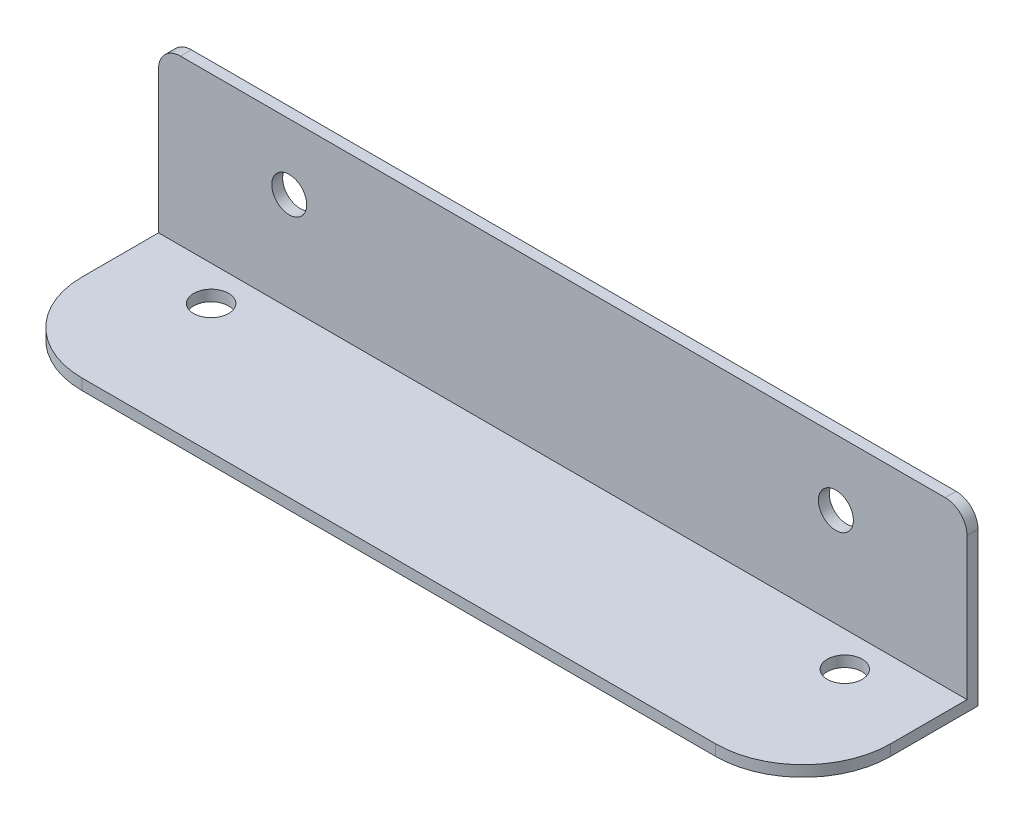
ISO-10303-21;
HEADER;
FILE_DESCRIPTION(('STEP AP214'),'2;1');
FILE_NAME('part.step','',(''),(''),'','','');
FILE_SCHEMA(('AUTOMOTIVE_DESIGN { 1 0 10303 214 1 1 1 1 }'));
ENDSEC;
DATA;
#1=APPLICATION_CONTEXT('core data for automotive mechanical design processes');
#2=APPLICATION_PROTOCOL_DEFINITION('international standard','automotive_design',2000,#1);
#3=PRODUCT_CONTEXT('',#1,'mechanical');
#4=PRODUCT('Part','Part','',(#3));
#5=PRODUCT_RELATED_PRODUCT_CATEGORY('part','',(#4));
#6=PRODUCT_DEFINITION_FORMATION('','',#4);
#7=PRODUCT_DEFINITION_CONTEXT('part definition',#1,'design');
#8=PRODUCT_DEFINITION('design','',#6,#7);
#9=PRODUCT_DEFINITION_SHAPE('','',#8);
#10=(LENGTH_UNIT() NAMED_UNIT(*) SI_UNIT(.MILLI.,.METRE.));
#11=(NAMED_UNIT(*) PLANE_ANGLE_UNIT() SI_UNIT($,.RADIAN.));
#12=(NAMED_UNIT(*) SI_UNIT($,.STERADIAN.) SOLID_ANGLE_UNIT());
#13=UNCERTAINTY_MEASURE_WITH_UNIT(LENGTH_MEASURE(1.E-05),#10,'distance_accuracy_value','');
#14=(GEOMETRIC_REPRESENTATION_CONTEXT(3) GLOBAL_UNCERTAINTY_ASSIGNED_CONTEXT((#13)) GLOBAL_UNIT_ASSIGNED_CONTEXT((#10,
#11,#12)) REPRESENTATION_CONTEXT('',''));
#15=CARTESIAN_POINT('',(0.,0.,0.));
#16=DIRECTION('',(0.,0.,1.));
#17=DIRECTION('',(1.,0.,0.));
#18=AXIS2_PLACEMENT_3D('',#15,#16,#17);
#19=CARTESIAN_POINT('',(0.,12.7,1.5875));
#20=DIRECTION('',(1.,0.,0.));
#21=DIRECTION('',(0.,1.,0.));
#22=AXIS2_PLACEMENT_3D('',#19,#20,#21);
#23=PLANE('',#22);
#24=DIRECTION('',(0.,-1.,0.));
#25=VECTOR('',#24,1.);
#26=CARTESIAN_POINT('',(0.,12.7,1.5875));
#27=LINE('',#26,#25);
#28=CARTESIAN_POINT('',(0.,9.525,1.5875));
#29=VERTEX_POINT('',#28);
#30=CARTESIAN_POINT('',(0.,-11.1125,1.5875));
#31=VERTEX_POINT('',#30);
#32=EDGE_CURVE('E111',#29,#31,#27,.T.);
#33=ORIENTED_EDGE('',*,*,#32,.F.);
#34=DIRECTION('',(0.,0.,-1.));
#35=VECTOR('',#34,1.);
#36=CARTESIAN_POINT('',(0.,9.525,1.5875));
#37=LINE('',#36,#35);
#38=CARTESIAN_POINT('',(0.,9.525,0.));
#39=VERTEX_POINT('',#38);
#40=EDGE_CURVE('E11',#29,#39,#37,.T.);
#41=ORIENTED_EDGE('',*,*,#40,.T.);
#42=DIRECTION('',(0.,-1.,0.));
#43=VECTOR('',#42,1.);
#44=CARTESIAN_POINT('',(0.,12.7,0.));
#45=LINE('',#44,#43);
#46=CARTESIAN_POINT('',(0.,-12.7,0.));
#47=VERTEX_POINT('',#46);
#48=EDGE_CURVE('E144',#39,#47,#45,.T.);
#49=ORIENTED_EDGE('',*,*,#48,.T.);
#50=DIRECTION('',(0.,0.,-1.));
#51=VECTOR('',#50,1.);
#52=CARTESIAN_POINT('',(0.,-12.7,1.5875));
#53=LINE('',#52,#51);
#54=CARTESIAN_POINT('',(0.,-12.7,12.7));
#55=VERTEX_POINT('',#54);
#56=EDGE_CURVE('E159',#55,#47,#53,.T.);
#57=ORIENTED_EDGE('',*,*,#56,.F.);
#58=DIRECTION('',(0.,-1.,0.));
#59=VECTOR('',#58,1.);
#60=CARTESIAN_POINT('',(0.,12.7,12.7));
#61=LINE('',#60,#59);
#62=CARTESIAN_POINT('',(0.,-11.1125,12.7));
#63=VERTEX_POINT('',#62);
#64=EDGE_CURVE('E125',#55,#63,#61,.F.);
#65=ORIENTED_EDGE('',*,*,#64,.T.);
#66=DIRECTION('',(0.,0.,-1.));
#67=VECTOR('',#66,1.);
#68=CARTESIAN_POINT('',(0.,-11.1125,25.4));
#69=LINE('',#68,#67);
#70=EDGE_CURVE('E122',#63,#31,#69,.T.);
#71=ORIENTED_EDGE('',*,*,#70,.T.);
#72=EDGE_LOOP('',(#33,#41,#49,#57,#65,#71));
#73=FACE_BOUND('',#72,.T.);
#74=ADVANCED_FACE('F33',(#73),#23,.F.);
#75=CARTESIAN_POINT('',(0.,-12.7,1.5875));
#76=DIRECTION('',(0.,1.,0.));
#77=DIRECTION('',(0.,0.,1.));
#78=AXIS2_PLACEMENT_3D('',#75,#76,#77);
#79=PLANE('',#78);
#80=CARTESIAN_POINT('',(104.6990032,-12.7,6.64845));
#81=DIRECTION('',(0.,1.,0.));
#82=DIRECTION('',(0.,0.,1.));
#83=AXIS2_PLACEMENT_3D('',#80,#81,#82);
#84=CIRCLE('',#83,2.54);
#85=CARTESIAN_POINT('',(104.6990032,-12.7,9.18845));
#86=VERTEX_POINT('',#85);
#87=EDGE_CURVE('E370',#86,#86,#84,.F.);
#88=ORIENTED_EDGE('',*,*,#87,.F.);
#89=EDGE_LOOP('',(#88));
#90=FACE_BOUND('',#89,.T.);
#91=CARTESIAN_POINT('',(12.7,-12.7,6.64845));
#92=DIRECTION('',(0.,1.,0.));
#93=DIRECTION('',(0.,0.,1.));
#94=AXIS2_PLACEMENT_3D('',#91,#92,#93);
#95=CIRCLE('',#94,2.54);
#96=CARTESIAN_POINT('',(12.7,-12.7,9.18845));
#97=VERTEX_POINT('',#96);
#98=EDGE_CURVE('E135',#97,#97,#95,.F.);
#99=ORIENTED_EDGE('',*,*,#98,.F.);
#100=EDGE_LOOP('',(#99));
#101=FACE_BOUND('',#100,.T.);
#102=DIRECTION('',(0.,0.,-1.));
#103=VECTOR('',#102,1.);
#104=CARTESIAN_POINT('',(117.4,-12.7,1.5875));
#105=LINE('',#104,#103);
#106=CARTESIAN_POINT('',(117.4,-12.7,12.7));
#107=VERTEX_POINT('',#106);
#108=CARTESIAN_POINT('',(117.4,-12.7,0.));
#109=VERTEX_POINT('',#108);
#110=EDGE_CURVE('E149',#107,#109,#105,.T.);
#111=ORIENTED_EDGE('',*,*,#110,.F.);
#112=CARTESIAN_POINT('',(104.7,-12.7,12.7));
#113=DIRECTION('',(0.,1.,0.));
#114=DIRECTION('',(0.,0.,1.));
#115=AXIS2_PLACEMENT_3D('',#112,#113,#114);
#116=CIRCLE('',#115,12.7);
#117=CARTESIAN_POINT('',(104.7,-12.7,25.4));
#118=VERTEX_POINT('',#117);
#119=EDGE_CURVE('E176',#107,#118,#116,.F.);
#120=ORIENTED_EDGE('',*,*,#119,.T.);
#121=DIRECTION('',(1.,0.,0.));
#122=VECTOR('',#121,1.);
#123=CARTESIAN_POINT('',(0.,-12.7,25.4));
#124=LINE('',#123,#122);
#125=CARTESIAN_POINT('',(12.7,-12.7,25.4));
#126=VERTEX_POINT('',#125);
#127=EDGE_CURVE('E134',#126,#118,#124,.T.);
#128=ORIENTED_EDGE('',*,*,#127,.F.);
#129=CARTESIAN_POINT('',(12.7,-12.7,12.7));
#130=DIRECTION('',(0.,1.,0.));
#131=DIRECTION('',(0.,0.,1.));
#132=AXIS2_PLACEMENT_3D('',#129,#130,#131);
#133=CIRCLE('',#132,12.7);
#134=EDGE_CURVE('E174',#126,#55,#133,.F.);
#135=ORIENTED_EDGE('',*,*,#134,.T.);
#136=ORIENTED_EDGE('',*,*,#56,.T.);
#137=DIRECTION('',(1.,0.,0.));
#138=VECTOR('',#137,1.);
#139=CARTESIAN_POINT('',(0.,-12.7,0.));
#140=LINE('',#139,#138);
#141=EDGE_CURVE('E151',#47,#109,#140,.T.);
#142=ORIENTED_EDGE('',*,*,#141,.T.);
#143=EDGE_LOOP('',(#111,#120,#128,#135,#136,#142));
#144=FACE_BOUND('',#143,.T.);
#145=ADVANCED_FACE('F207',(#90,#101,#144),#79,.F.);
#146=CARTESIAN_POINT('',(117.4,12.7,1.5875));
#147=DIRECTION('',(-1.,0.,0.));
#148=DIRECTION('',(0.,0.,1.));
#149=AXIS2_PLACEMENT_3D('',#146,#147,#148);
#150=PLANE('',#149);
#151=DIRECTION('',(0.,1.,0.));
#152=VECTOR('',#151,1.);
#153=CARTESIAN_POINT('',(117.4,12.7,0.));
#154=LINE('',#153,#152);
#155=CARTESIAN_POINT('',(117.4,9.525,0.));
#156=VERTEX_POINT('',#155);
#157=EDGE_CURVE('E154',#109,#156,#154,.T.);
#158=ORIENTED_EDGE('',*,*,#157,.T.);
#159=DIRECTION('',(0.,0.,-1.));
#160=VECTOR('',#159,1.);
#161=CARTESIAN_POINT('',(117.4,9.525,1.5875));
#162=LINE('',#161,#160);
#163=CARTESIAN_POINT('',(117.4,9.525,1.5875));
#164=VERTEX_POINT('',#163);
#165=EDGE_CURVE('E56',#156,#164,#162,.F.);
#166=ORIENTED_EDGE('',*,*,#165,.T.);
#167=DIRECTION('',(0.,1.,0.));
#168=VECTOR('',#167,1.);
#169=CARTESIAN_POINT('',(117.4,12.7,1.5875));
#170=LINE('',#169,#168);
#171=CARTESIAN_POINT('',(117.4,-11.1125,1.5875));
#172=VERTEX_POINT('',#171);
#173=EDGE_CURVE('E118',#172,#164,#170,.T.);
#174=ORIENTED_EDGE('',*,*,#173,.F.);
#175=DIRECTION('',(0.,0.,-1.));
#176=VECTOR('',#175,1.);
#177=CARTESIAN_POINT('',(117.4,-11.1125,25.4));
#178=LINE('',#177,#176);
#179=CARTESIAN_POINT('',(117.4,-11.1125,12.7));
#180=VERTEX_POINT('',#179);
#181=EDGE_CURVE('E128',#180,#172,#178,.T.);
#182=ORIENTED_EDGE('',*,*,#181,.F.);
#183=DIRECTION('',(0.,1.,0.));
#184=VECTOR('',#183,1.);
#185=CARTESIAN_POINT('',(117.4,12.7,12.7));
#186=LINE('',#185,#184);
#187=EDGE_CURVE('E172',#180,#107,#186,.F.);
#188=ORIENTED_EDGE('',*,*,#187,.T.);
#189=ORIENTED_EDGE('',*,*,#110,.T.);
#190=EDGE_LOOP('',(#158,#166,#174,#182,#188,#189));
#191=FACE_BOUND('',#190,.T.);
#192=ADVANCED_FACE('F202',(#191),#150,.F.);
#193=CARTESIAN_POINT('',(0.,12.7,1.5875));
#194=DIRECTION('',(0.,-1.,0.));
#195=DIRECTION('',(0.,0.,-1.));
#196=AXIS2_PLACEMENT_3D('',#193,#194,#195);
#197=PLANE('',#196);
#198=DIRECTION('',(-1.,0.,0.));
#199=VECTOR('',#198,1.);
#200=CARTESIAN_POINT('',(0.,12.7,1.5875));
#201=LINE('',#200,#199);
#202=CARTESIAN_POINT('',(114.225,12.7,1.5875));
#203=VERTEX_POINT('',#202);
#204=CARTESIAN_POINT('',(3.175,12.7,1.5875));
#205=VERTEX_POINT('',#204);
#206=EDGE_CURVE('E147',#203,#205,#201,.T.);
#207=ORIENTED_EDGE('',*,*,#206,.F.);
#208=DIRECTION('',(0.,0.,-1.));
#209=VECTOR('',#208,1.);
#210=CARTESIAN_POINT('',(114.225,12.7,1.5875));
#211=LINE('',#210,#209);
#212=CARTESIAN_POINT('',(114.225,12.7,0.));
#213=VERTEX_POINT('',#212);
#214=EDGE_CURVE('E181',#203,#213,#211,.T.);
#215=ORIENTED_EDGE('',*,*,#214,.T.);
#216=DIRECTION('',(-1.,0.,0.));
#217=VECTOR('',#216,1.);
#218=CARTESIAN_POINT('',(0.,12.7,0.));
#219=LINE('',#218,#217);
#220=CARTESIAN_POINT('',(3.175,12.7,0.));
#221=VERTEX_POINT('',#220);
#222=EDGE_CURVE('E119',#213,#221,#219,.T.);
#223=ORIENTED_EDGE('',*,*,#222,.T.);
#224=DIRECTION('',(0.,0.,-1.));
#225=VECTOR('',#224,1.);
#226=CARTESIAN_POINT('',(3.175,12.7,1.5875));
#227=LINE('',#226,#225);
#228=EDGE_CURVE('E179',#221,#205,#227,.F.);
#229=ORIENTED_EDGE('',*,*,#228,.T.);
#230=EDGE_LOOP('',(#207,#215,#223,#229));
#231=FACE_BOUND('',#230,.T.);
#232=ADVANCED_FACE('F194',(#231),#197,.F.);
#233=CARTESIAN_POINT('',(0.,0.,1.5875));
#234=DIRECTION('',(0.,0.,1.));
#235=DIRECTION('',(1.,0.,0.));
#236=AXIS2_PLACEMENT_3D('',#233,#234,#235);
#237=PLANE('',#236);
#238=CARTESIAN_POINT('',(98.35,3.17500000000001,1.5875));
#239=DIRECTION('',(0.,0.,1.));
#240=DIRECTION('',(1.,0.,0.));
#241=AXIS2_PLACEMENT_3D('',#238,#239,#240);
#242=CIRCLE('',#241,2.54);
#243=CARTESIAN_POINT('',(100.89,3.17500000000001,1.5875));
#244=VERTEX_POINT('',#243);
#245=EDGE_CURVE('E391',#244,#244,#242,.T.);
#246=ORIENTED_EDGE('',*,*,#245,.F.);
#247=EDGE_LOOP('',(#246));
#248=FACE_BOUND('',#247,.T.);
#249=CARTESIAN_POINT('',(18.975,3.175,1.5875));
#250=DIRECTION('',(0.,0.,1.));
#251=DIRECTION('',(1.,0.,0.));
#252=AXIS2_PLACEMENT_3D('',#249,#250,#251);
#253=CIRCLE('',#252,2.54);
#254=CARTESIAN_POINT('',(21.515,3.175,1.5875));
#255=VERTEX_POINT('',#254);
#256=EDGE_CURVE('E378',#255,#255,#253,.T.);
#257=ORIENTED_EDGE('',*,*,#256,.F.);
#258=EDGE_LOOP('',(#257));
#259=FACE_BOUND('',#258,.T.);
#260=ORIENTED_EDGE('',*,*,#173,.T.);
#261=CARTESIAN_POINT('',(114.225,9.525,1.5875));
#262=DIRECTION('',(0.,0.,1.));
#263=DIRECTION('',(1.,0.,0.));
#264=AXIS2_PLACEMENT_3D('',#261,#262,#263);
#265=CIRCLE('',#264,3.175);
#266=EDGE_CURVE('E41',#164,#203,#265,.T.);
#267=ORIENTED_EDGE('',*,*,#266,.T.);
#268=ORIENTED_EDGE('',*,*,#206,.T.);
#269=CARTESIAN_POINT('',(3.175,9.525,1.5875));
#270=DIRECTION('',(0.,0.,1.));
#271=DIRECTION('',(1.,0.,0.));
#272=AXIS2_PLACEMENT_3D('',#269,#270,#271);
#273=CIRCLE('',#272,3.175);
#274=EDGE_CURVE('E48',#205,#29,#273,.T.);
#275=ORIENTED_EDGE('',*,*,#274,.T.);
#276=ORIENTED_EDGE('',*,*,#32,.T.);
#277=DIRECTION('',(-1.,0.,0.));
#278=VECTOR('',#277,1.);
#279=CARTESIAN_POINT('',(0.,-11.1125,1.5875));
#280=LINE('',#279,#278);
#281=EDGE_CURVE('E115',#172,#31,#280,.T.);
#282=ORIENTED_EDGE('',*,*,#281,.F.);
#283=EDGE_LOOP('',(#260,#267,#268,#275,#276,#282));
#284=FACE_BOUND('',#283,.T.);
#285=ADVANCED_FACE('F113',(#248,#259,#284),#237,.T.);
#286=CARTESIAN_POINT('',(0.,0.,0.));
#287=DIRECTION('',(0.,0.,1.));
#288=DIRECTION('',(1.,0.,0.));
#289=AXIS2_PLACEMENT_3D('',#286,#287,#288);
#290=PLANE('',#289);
#291=CARTESIAN_POINT('',(98.35,3.17500000000001,0.));
#292=DIRECTION('',(0.,0.,1.));
#293=DIRECTION('',(1.,0.,0.));
#294=AXIS2_PLACEMENT_3D('',#291,#292,#293);
#295=CIRCLE('',#294,2.54);
#296=CARTESIAN_POINT('',(100.89,3.17500000000001,0.));
#297=VERTEX_POINT('',#296);
#298=EDGE_CURVE('E388',#297,#297,#295,.F.);
#299=ORIENTED_EDGE('',*,*,#298,.F.);
#300=EDGE_LOOP('',(#299));
#301=FACE_BOUND('',#300,.T.);
#302=CARTESIAN_POINT('',(18.975,3.175,0.));
#303=DIRECTION('',(0.,0.,1.));
#304=DIRECTION('',(1.,0.,0.));
#305=AXIS2_PLACEMENT_3D('',#302,#303,#304);
#306=CIRCLE('',#305,2.54);
#307=CARTESIAN_POINT('',(21.515,3.175,0.));
#308=VERTEX_POINT('',#307);
#309=EDGE_CURVE('E374',#308,#308,#306,.F.);
#310=ORIENTED_EDGE('',*,*,#309,.F.);
#311=EDGE_LOOP('',(#310));
#312=FACE_BOUND('',#311,.T.);
#313=ORIENTED_EDGE('',*,*,#222,.F.);
#314=CARTESIAN_POINT('',(114.225,9.525,0.));
#315=DIRECTION('',(0.,0.,1.));
#316=DIRECTION('',(1.,0.,0.));
#317=AXIS2_PLACEMENT_3D('',#314,#315,#316);
#318=CIRCLE('',#317,3.175);
#319=EDGE_CURVE('E186',#213,#156,#318,.F.);
#320=ORIENTED_EDGE('',*,*,#319,.T.);
#321=ORIENTED_EDGE('',*,*,#157,.F.);
#322=ORIENTED_EDGE('',*,*,#141,.F.);
#323=ORIENTED_EDGE('',*,*,#48,.F.);
#324=CARTESIAN_POINT('',(3.175,9.525,0.));
#325=DIRECTION('',(0.,0.,1.));
#326=DIRECTION('',(1.,0.,0.));
#327=AXIS2_PLACEMENT_3D('',#324,#325,#326);
#328=CIRCLE('',#327,3.175);
#329=EDGE_CURVE('E184',#39,#221,#328,.F.);
#330=ORIENTED_EDGE('',*,*,#329,.T.);
#331=EDGE_LOOP('',(#313,#320,#321,#322,#323,#330));
#332=FACE_BOUND('',#331,.T.);
#333=ADVANCED_FACE('F200',(#301,#312,#332),#290,.F.);
#334=CARTESIAN_POINT('',(0.,-11.1125,25.4));
#335=DIRECTION('',(0.,-1.,0.));
#336=DIRECTION('',(0.,0.,-1.));
#337=AXIS2_PLACEMENT_3D('',#334,#335,#336);
#338=PLANE('',#337);
#339=CARTESIAN_POINT('',(104.6990032,-11.1125,6.64845));
#340=DIRECTION('',(0.,1.,0.));
#341=DIRECTION('',(0.,0.,1.));
#342=AXIS2_PLACEMENT_3D('',#339,#340,#341);
#343=CIRCLE('',#342,2.54);
#344=CARTESIAN_POINT('',(104.6990032,-11.1125,9.18845));
#345=VERTEX_POINT('',#344);
#346=EDGE_CURVE('E373',#345,#345,#343,.T.);
#347=ORIENTED_EDGE('',*,*,#346,.F.);
#348=EDGE_LOOP('',(#347));
#349=FACE_BOUND('',#348,.T.);
#350=CARTESIAN_POINT('',(12.7,-11.1125,6.64845));
#351=DIRECTION('',(0.,1.,0.));
#352=DIRECTION('',(0.,0.,1.));
#353=AXIS2_PLACEMENT_3D('',#350,#351,#352);
#354=CIRCLE('',#353,2.54);
#355=CARTESIAN_POINT('',(12.7,-11.1125,9.18845));
#356=VERTEX_POINT('',#355);
#357=EDGE_CURVE('E140',#356,#356,#354,.T.);
#358=ORIENTED_EDGE('',*,*,#357,.F.);
#359=EDGE_LOOP('',(#358));
#360=FACE_BOUND('',#359,.T.);
#361=DIRECTION('',(-1.,0.,0.));
#362=VECTOR('',#361,1.);
#363=CARTESIAN_POINT('',(0.,-11.1125,25.4));
#364=LINE('',#363,#362);
#365=CARTESIAN_POINT('',(104.7,-11.1125,25.4));
#366=VERTEX_POINT('',#365);
#367=CARTESIAN_POINT('',(12.7,-11.1125,25.4));
#368=VERTEX_POINT('',#367);
#369=EDGE_CURVE('E129',#366,#368,#364,.T.);
#370=ORIENTED_EDGE('',*,*,#369,.F.);
#371=CARTESIAN_POINT('',(104.7,-11.1125,12.7));
#372=DIRECTION('',(0.,-1.,0.));
#373=DIRECTION('',(0.,0.,-1.));
#374=AXIS2_PLACEMENT_3D('',#371,#372,#373);
#375=CIRCLE('',#374,12.7);
#376=EDGE_CURVE('E170',#366,#180,#375,.F.);
#377=ORIENTED_EDGE('',*,*,#376,.T.);
#378=ORIENTED_EDGE('',*,*,#181,.T.);
#379=ORIENTED_EDGE('',*,*,#281,.T.);
#380=ORIENTED_EDGE('',*,*,#70,.F.);
#381=CARTESIAN_POINT('',(12.7,-11.1125,12.7));
#382=DIRECTION('',(0.,-1.,0.));
#383=DIRECTION('',(0.,0.,-1.));
#384=AXIS2_PLACEMENT_3D('',#381,#382,#383);
#385=CIRCLE('',#384,12.7);
#386=EDGE_CURVE('E168',#63,#368,#385,.F.);
#387=ORIENTED_EDGE('',*,*,#386,.T.);
#388=EDGE_LOOP('',(#370,#377,#378,#379,#380,#387));
#389=FACE_BOUND('',#388,.T.);
#390=ADVANCED_FACE('F132',(#349,#360,#389),#338,.F.);
#391=CARTESIAN_POINT('',(0.,0.,25.4));
#392=DIRECTION('',(0.,0.,-1.));
#393=DIRECTION('',(-1.,0.,0.));
#394=AXIS2_PLACEMENT_3D('',#391,#392,#393);
#395=PLANE('',#394);
#396=ORIENTED_EDGE('',*,*,#127,.T.);
#397=DIRECTION('',(0.,1.,0.));
#398=VECTOR('',#397,1.);
#399=CARTESIAN_POINT('',(104.7,0.,25.4));
#400=LINE('',#399,#398);
#401=EDGE_CURVE('E165',#118,#366,#400,.T.);
#402=ORIENTED_EDGE('',*,*,#401,.T.);
#403=ORIENTED_EDGE('',*,*,#369,.T.);
#404=DIRECTION('',(0.,-1.,0.));
#405=VECTOR('',#404,1.);
#406=CARTESIAN_POINT('',(12.7,0.,25.4));
#407=LINE('',#406,#405);
#408=EDGE_CURVE('E162',#368,#126,#407,.T.);
#409=ORIENTED_EDGE('',*,*,#408,.T.);
#410=EDGE_LOOP('',(#396,#402,#403,#409));
#411=FACE_BOUND('',#410,.T.);
#412=ADVANCED_FACE('F236',(#411),#395,.F.);
#413=CARTESIAN_POINT('',(12.7,-19.8842048968553,6.64845));
#414=DIRECTION('',(0.,1.,0.));
#415=DIRECTION('',(0.,0.,1.));
#416=AXIS2_PLACEMENT_3D('',#413,#414,#415);
#417=CYLINDRICAL_SURFACE('',#416,2.54);
#418=CARTESIAN_POINT('',(12.7,-12.7,9.18845));
#419=CARTESIAN_POINT('',(12.7,-12.6834635416667,9.18845));
#420=CARTESIAN_POINT('',(12.7,-12.6669270833333,9.18845));
#421=CARTESIAN_POINT('',(12.7,-12.6338541666667,9.18845));
#422=CARTESIAN_POINT('',(12.7,-12.6173177083333,9.18845));
#423=CARTESIAN_POINT('',(12.7,-12.5842447916667,9.18845));
#424=CARTESIAN_POINT('',(12.7,-12.5677083333333,9.18845));
#425=CARTESIAN_POINT('',(12.7,-12.5346354166667,9.18845));
#426=CARTESIAN_POINT('',(12.7,-12.5180989583333,9.18845));
#427=CARTESIAN_POINT('',(12.7,-12.4850260416667,9.18845));
#428=CARTESIAN_POINT('',(12.7,-12.4684895833333,9.18845));
#429=CARTESIAN_POINT('',(12.7,-12.4354166666667,9.18845));
#430=CARTESIAN_POINT('',(12.7,-12.4188802083333,9.18845));
#431=CARTESIAN_POINT('',(12.7,-12.3858072916667,9.18845));
#432=CARTESIAN_POINT('',(12.7,-12.3692708333333,9.18845));
#433=CARTESIAN_POINT('',(12.7,-12.3361979166667,9.18845));
#434=CARTESIAN_POINT('',(12.7,-12.3196614583333,9.18845));
#435=CARTESIAN_POINT('',(12.7,-12.2865885416667,9.18845));
#436=CARTESIAN_POINT('',(12.7,-12.2700520833333,9.18845));
#437=CARTESIAN_POINT('',(12.7,-12.2369791666667,9.18845));
#438=CARTESIAN_POINT('',(12.7,-12.2204427083333,9.18845));
#439=CARTESIAN_POINT('',(12.7,-12.1873697916667,9.18845));
#440=CARTESIAN_POINT('',(12.7,-12.1708333333333,9.18845));
#441=CARTESIAN_POINT('',(12.7,-12.1377604166667,9.18845));
#442=CARTESIAN_POINT('',(12.7,-12.1212239583333,9.18845));
#443=CARTESIAN_POINT('',(12.7,-12.0881510416667,9.18845));
#444=CARTESIAN_POINT('',(12.7,-12.0716145833333,9.18845));
#445=CARTESIAN_POINT('',(12.7,-12.0385416666667,9.18845));
#446=CARTESIAN_POINT('',(12.7,-12.0220052083333,9.18845));
#447=CARTESIAN_POINT('',(12.7,-11.9889322916667,9.18845));
#448=CARTESIAN_POINT('',(12.7,-11.9723958333333,9.18845));
#449=CARTESIAN_POINT('',(12.7,-11.9393229166667,9.18845));
#450=CARTESIAN_POINT('',(12.7,-11.9227864583333,9.18845));
#451=CARTESIAN_POINT('',(12.7,-11.8897135416667,9.18845));
#452=CARTESIAN_POINT('',(12.7,-11.8731770833333,9.18845));
#453=CARTESIAN_POINT('',(12.7,-11.8401041666667,9.18845));
#454=CARTESIAN_POINT('',(12.7,-11.8235677083333,9.18845));
#455=CARTESIAN_POINT('',(12.7,-11.7904947916667,9.18845));
#456=CARTESIAN_POINT('',(12.7,-11.7739583333333,9.18845));
#457=CARTESIAN_POINT('',(12.7,-11.7408854166667,9.18845));
#458=CARTESIAN_POINT('',(12.7,-11.7243489583333,9.18845));
#459=CARTESIAN_POINT('',(12.7,-11.6912760416667,9.18845));
#460=CARTESIAN_POINT('',(12.7,-11.6747395833333,9.18845));
#461=CARTESIAN_POINT('',(12.7,-11.6416666666667,9.18845));
#462=CARTESIAN_POINT('',(12.7,-11.6251302083333,9.18845));
#463=CARTESIAN_POINT('',(12.7,-11.5920572916667,9.18845));
#464=CARTESIAN_POINT('',(12.7,-11.5755208333333,9.18845));
#465=CARTESIAN_POINT('',(12.7,-11.5424479166667,9.18845));
#466=CARTESIAN_POINT('',(12.7,-11.5259114583333,9.18845));
#467=CARTESIAN_POINT('',(12.7,-11.4928385416667,9.18845));
#468=CARTESIAN_POINT('',(12.7,-11.4763020833333,9.18845));
#469=CARTESIAN_POINT('',(12.7,-11.4432291666667,9.18845));
#470=CARTESIAN_POINT('',(12.7,-11.4266927083333,9.18845));
#471=CARTESIAN_POINT('',(12.7,-11.3936197916667,9.18845));
#472=CARTESIAN_POINT('',(12.7,-11.3770833333333,9.18845));
#473=CARTESIAN_POINT('',(12.7,-11.3440104166667,9.18845));
#474=CARTESIAN_POINT('',(12.7,-11.3274739583333,9.18845));
#475=CARTESIAN_POINT('',(12.7,-11.2944010416667,9.18845));
#476=CARTESIAN_POINT('',(12.7,-11.2778645833333,9.18845));
#477=CARTESIAN_POINT('',(12.7,-11.2447916666667,9.18845));
#478=CARTESIAN_POINT('',(12.7,-11.2282552083333,9.18845));
#479=CARTESIAN_POINT('',(12.7,-11.1951822916667,9.18845));
#480=CARTESIAN_POINT('',(12.7,-11.1786458333333,9.18845));
#481=CARTESIAN_POINT('',(12.7,-11.1455729166667,9.18845));
#482=CARTESIAN_POINT('',(12.7,-11.1290364583333,9.18845));
#483=CARTESIAN_POINT('',(12.7,-11.1125,9.18845));
#484=B_SPLINE_CURVE_WITH_KNOTS('',3,(#418,#419,#420,#421,#422,#423,#424,#425,#426,#427,#428,
#429,#430,#431,#432,#433,#434,#435,#436,#437,#438,#439,#440,#441,#442,#443,#444,#445,#446,#447,
#448,#449,#450,#451,#452,#453,#454,#455,#456,#457,#458,#459,#460,#461,#462,#463,#464,#465,#466,
#467,#468,#469,#470,#471,#472,#473,#474,#475,#476,#477,#478,#479,#480,#481,#482,#483),
.UNSPECIFIED.,.F.,.F.,(4,2,2,2,2,2,2,2,2,2,2,2,2,2,2,2,2,2,2,2,2,2,2,2,2,2,2,2,2,2,2,2,4),(0.,
0.0496093749999989,0.0992187499999995,0.148828125,0.198437499999999,0.248046875,0.29765625,
0.347265624999999,0.396875,0.446484375,0.496093749999999,0.545703125,0.5953125,
0.644921874999999,0.69453125,0.744140624999999,0.793749999999999,0.843359375,0.892968749999999,
0.942578124999999,0.9921875,1.041796875,1.09140625,1.141015625,1.190625,1.240234375,1.28984375,
1.339453125,1.3890625,1.438671875,1.48828125,1.537890625,1.5875),.UNSPECIFIED.);
#485=EDGE_CURVE('BSEAM240',#97,#356,#484,.T.);
#486=ORIENTED_EDGE('',*,*,#98,.T.);
#487=ORIENTED_EDGE('',*,*,#357,.T.);
#488=ORIENTED_EDGE('',*,*,#485,.T.);
#489=ORIENTED_EDGE('',*,*,#485,.F.);
#490=EDGE_LOOP('',(#486,#488,#487,#489));
#491=FACE_BOUND('',#490,.T.);
#492=ADVANCED_FACE('F240',(#491),#417,.F.);
#493=CARTESIAN_POINT('',(104.6990032,-19.8842048968553,6.64845));
#494=DIRECTION('',(0.,1.,0.));
#495=DIRECTION('',(0.,0.,1.));
#496=AXIS2_PLACEMENT_3D('',#493,#494,#495);
#497=CYLINDRICAL_SURFACE('',#496,2.54);
#498=CARTESIAN_POINT('',(104.6990032,-12.7,9.18845));
#499=CARTESIAN_POINT('',(104.6990032,-12.6834635416667,9.18845));
#500=CARTESIAN_POINT('',(104.6990032,-12.6669270833333,9.18845));
#501=CARTESIAN_POINT('',(104.6990032,-12.6338541666667,9.18845));
#502=CARTESIAN_POINT('',(104.6990032,-12.6173177083333,9.18845));
#503=CARTESIAN_POINT('',(104.6990032,-12.5842447916667,9.18845));
#504=CARTESIAN_POINT('',(104.6990032,-12.5677083333333,9.18845));
#505=CARTESIAN_POINT('',(104.6990032,-12.5346354166667,9.18845));
#506=CARTESIAN_POINT('',(104.6990032,-12.5180989583333,9.18845));
#507=CARTESIAN_POINT('',(104.6990032,-12.4850260416667,9.18845));
#508=CARTESIAN_POINT('',(104.6990032,-12.4684895833333,9.18845));
#509=CARTESIAN_POINT('',(104.6990032,-12.4354166666667,9.18845));
#510=CARTESIAN_POINT('',(104.6990032,-12.4188802083333,9.18845));
#511=CARTESIAN_POINT('',(104.6990032,-12.3858072916667,9.18845));
#512=CARTESIAN_POINT('',(104.6990032,-12.3692708333333,9.18845));
#513=CARTESIAN_POINT('',(104.6990032,-12.3361979166667,9.18845));
#514=CARTESIAN_POINT('',(104.6990032,-12.3196614583333,9.18845));
#515=CARTESIAN_POINT('',(104.6990032,-12.2865885416667,9.18845));
#516=CARTESIAN_POINT('',(104.6990032,-12.2700520833333,9.18845));
#517=CARTESIAN_POINT('',(104.6990032,-12.2369791666667,9.18845));
#518=CARTESIAN_POINT('',(104.6990032,-12.2204427083333,9.18845));
#519=CARTESIAN_POINT('',(104.6990032,-12.1873697916667,9.18845));
#520=CARTESIAN_POINT('',(104.6990032,-12.1708333333333,9.18845));
#521=CARTESIAN_POINT('',(104.6990032,-12.1377604166667,9.18845));
#522=CARTESIAN_POINT('',(104.6990032,-12.1212239583333,9.18845));
#523=CARTESIAN_POINT('',(104.6990032,-12.0881510416667,9.18845));
#524=CARTESIAN_POINT('',(104.6990032,-12.0716145833333,9.18845));
#525=CARTESIAN_POINT('',(104.6990032,-12.0385416666667,9.18845));
#526=CARTESIAN_POINT('',(104.6990032,-12.0220052083333,9.18845));
#527=CARTESIAN_POINT('',(104.6990032,-11.9889322916667,9.18845));
#528=CARTESIAN_POINT('',(104.6990032,-11.9723958333333,9.18845));
#529=CARTESIAN_POINT('',(104.6990032,-11.9393229166667,9.18845));
#530=CARTESIAN_POINT('',(104.6990032,-11.9227864583333,9.18845));
#531=CARTESIAN_POINT('',(104.6990032,-11.8897135416667,9.18845));
#532=CARTESIAN_POINT('',(104.6990032,-11.8731770833333,9.18845));
#533=CARTESIAN_POINT('',(104.6990032,-11.8401041666667,9.18845));
#534=CARTESIAN_POINT('',(104.6990032,-11.8235677083333,9.18845));
#535=CARTESIAN_POINT('',(104.6990032,-11.7904947916667,9.18845));
#536=CARTESIAN_POINT('',(104.6990032,-11.7739583333333,9.18845));
#537=CARTESIAN_POINT('',(104.6990032,-11.7408854166667,9.18845));
#538=CARTESIAN_POINT('',(104.6990032,-11.7243489583333,9.18845));
#539=CARTESIAN_POINT('',(104.6990032,-11.6912760416667,9.18845));
#540=CARTESIAN_POINT('',(104.6990032,-11.6747395833333,9.18845));
#541=CARTESIAN_POINT('',(104.6990032,-11.6416666666667,9.18845));
#542=CARTESIAN_POINT('',(104.6990032,-11.6251302083333,9.18845));
#543=CARTESIAN_POINT('',(104.6990032,-11.5920572916667,9.18845));
#544=CARTESIAN_POINT('',(104.6990032,-11.5755208333333,9.18845));
#545=CARTESIAN_POINT('',(104.6990032,-11.5424479166667,9.18845));
#546=CARTESIAN_POINT('',(104.6990032,-11.5259114583333,9.18845));
#547=CARTESIAN_POINT('',(104.6990032,-11.4928385416667,9.18845));
#548=CARTESIAN_POINT('',(104.6990032,-11.4763020833333,9.18845));
#549=CARTESIAN_POINT('',(104.6990032,-11.4432291666667,9.18845));
#550=CARTESIAN_POINT('',(104.6990032,-11.4266927083333,9.18845));
#551=CARTESIAN_POINT('',(104.6990032,-11.3936197916667,9.18845));
#552=CARTESIAN_POINT('',(104.6990032,-11.3770833333333,9.18845));
#553=CARTESIAN_POINT('',(104.6990032,-11.3440104166667,9.18845));
#554=CARTESIAN_POINT('',(104.6990032,-11.3274739583333,9.18845));
#555=CARTESIAN_POINT('',(104.6990032,-11.2944010416667,9.18845));
#556=CARTESIAN_POINT('',(104.6990032,-11.2778645833333,9.18845));
#557=CARTESIAN_POINT('',(104.6990032,-11.2447916666667,9.18845));
#558=CARTESIAN_POINT('',(104.6990032,-11.2282552083333,9.18845));
#559=CARTESIAN_POINT('',(104.6990032,-11.1951822916667,9.18845));
#560=CARTESIAN_POINT('',(104.6990032,-11.1786458333333,9.18845));
#561=CARTESIAN_POINT('',(104.6990032,-11.1455729166667,9.18845));
#562=CARTESIAN_POINT('',(104.6990032,-11.1290364583333,9.18845));
#563=CARTESIAN_POINT('',(104.6990032,-11.1125,9.18845));
#564=B_SPLINE_CURVE_WITH_KNOTS('',3,(#498,#499,#500,#501,#502,#503,#504,#505,#506,#507,#508,
#509,#510,#511,#512,#513,#514,#515,#516,#517,#518,#519,#520,#521,#522,#523,#524,#525,#526,#527,
#528,#529,#530,#531,#532,#533,#534,#535,#536,#537,#538,#539,#540,#541,#542,#543,#544,#545,#546,
#547,#548,#549,#550,#551,#552,#553,#554,#555,#556,#557,#558,#559,#560,#561,#562,#563),
.UNSPECIFIED.,.F.,.F.,(4,2,2,2,2,2,2,2,2,2,2,2,2,2,2,2,2,2,2,2,2,2,2,2,2,2,2,2,2,2,2,2,4),(0.,
0.0496093749999989,0.0992187499999995,0.148828125,0.198437499999999,0.248046875,0.29765625,
0.347265624999999,0.396875,0.446484375,0.496093749999999,0.545703125,0.5953125,
0.644921874999999,0.69453125,0.744140624999999,0.793749999999999,0.843359375,0.892968749999999,
0.942578124999999,0.9921875,1.041796875,1.09140625,1.141015625,1.190625,1.240234375,1.28984375,
1.339453125,1.3890625,1.438671875,1.48828125,1.537890625,1.5875),.UNSPECIFIED.);
#565=EDGE_CURVE('BSEAM246',#86,#345,#564,.T.);
#566=ORIENTED_EDGE('',*,*,#87,.T.);
#567=ORIENTED_EDGE('',*,*,#346,.T.);
#568=ORIENTED_EDGE('',*,*,#565,.T.);
#569=ORIENTED_EDGE('',*,*,#565,.F.);
#570=EDGE_LOOP('',(#566,#568,#567,#569));
#571=FACE_BOUND('',#570,.T.);
#572=ADVANCED_FACE('F246',(#571),#497,.F.);
#573=CARTESIAN_POINT('',(18.975,3.175,-7.18420489685533));
#574=DIRECTION('',(0.,0.,1.));
#575=DIRECTION('',(1.,0.,0.));
#576=AXIS2_PLACEMENT_3D('',#573,#574,#575);
#577=CYLINDRICAL_SURFACE('',#576,2.54);
#578=ORIENTED_EDGE('',*,*,#309,.T.);
#579=EDGE_LOOP('',(#578));
#580=FACE_BOUND('',#579,.T.);
#581=ORIENTED_EDGE('',*,*,#256,.T.);
#582=EDGE_LOOP('',(#581));
#583=FACE_BOUND('',#582,.T.);
#584=ADVANCED_FACE('F340',(#580,#583),#577,.F.);
#585=CARTESIAN_POINT('',(98.35,3.17500000000001,-7.18420489685533));
#586=DIRECTION('',(0.,0.,1.));
#587=DIRECTION('',(1.,0.,0.));
#588=AXIS2_PLACEMENT_3D('',#585,#586,#587);
#589=CYLINDRICAL_SURFACE('',#588,2.54);
#590=ORIENTED_EDGE('',*,*,#298,.T.);
#591=EDGE_LOOP('',(#590));
#592=FACE_BOUND('',#591,.T.);
#593=ORIENTED_EDGE('',*,*,#245,.T.);
#594=EDGE_LOOP('',(#593));
#595=FACE_BOUND('',#594,.T.);
#596=ADVANCED_FACE('F227',(#592,#595),#589,.F.);
#597=CARTESIAN_POINT('',(104.7,0.,12.7));
#598=DIRECTION('',(0.,1.,0.));
#599=DIRECTION('',(0.,0.,1.));
#600=AXIS2_PLACEMENT_3D('',#597,#598,#599);
#601=CYLINDRICAL_SURFACE('',#600,12.7);
#602=ORIENTED_EDGE('',*,*,#119,.F.);
#603=ORIENTED_EDGE('',*,*,#187,.F.);
#604=ORIENTED_EDGE('',*,*,#376,.F.);
#605=ORIENTED_EDGE('',*,*,#401,.F.);
#606=EDGE_LOOP('',(#602,#603,#604,#605));
#607=FACE_BOUND('',#606,.T.);
#608=ADVANCED_FACE('F224',(#607),#601,.T.);
#609=CARTESIAN_POINT('',(12.7,0.,12.7));
#610=DIRECTION('',(0.,-1.,0.));
#611=DIRECTION('',(1.,0.,0.));
#612=AXIS2_PLACEMENT_3D('',#609,#610,#611);
#613=CYLINDRICAL_SURFACE('',#612,12.7);
#614=ORIENTED_EDGE('',*,*,#386,.F.);
#615=ORIENTED_EDGE('',*,*,#64,.F.);
#616=ORIENTED_EDGE('',*,*,#134,.F.);
#617=ORIENTED_EDGE('',*,*,#408,.F.);
#618=EDGE_LOOP('',(#614,#615,#616,#617));
#619=FACE_BOUND('',#618,.T.);
#620=ADVANCED_FACE('F214',(#619),#613,.T.);
#621=CARTESIAN_POINT('',(114.225,9.525,1.5875));
#622=DIRECTION('',(0.,0.,-1.));
#623=DIRECTION('',(-1.,0.,0.));
#624=AXIS2_PLACEMENT_3D('',#621,#622,#623);
#625=CYLINDRICAL_SURFACE('',#624,3.175);
#626=ORIENTED_EDGE('',*,*,#266,.F.);
#627=ORIENTED_EDGE('',*,*,#165,.F.);
#628=ORIENTED_EDGE('',*,*,#319,.F.);
#629=ORIENTED_EDGE('',*,*,#214,.F.);
#630=EDGE_LOOP('',(#626,#627,#628,#629));
#631=FACE_BOUND('',#630,.T.);
#632=ADVANCED_FACE('F197',(#631),#625,.T.);
#633=CARTESIAN_POINT('',(3.175,9.525,1.5875));
#634=DIRECTION('',(0.,0.,-1.));
#635=DIRECTION('',(-1.,0.,0.));
#636=AXIS2_PLACEMENT_3D('',#633,#634,#635);
#637=CYLINDRICAL_SURFACE('',#636,3.175);
#638=ORIENTED_EDGE('',*,*,#274,.F.);
#639=ORIENTED_EDGE('',*,*,#228,.F.);
#640=ORIENTED_EDGE('',*,*,#329,.F.);
#641=ORIENTED_EDGE('',*,*,#40,.F.);
#642=EDGE_LOOP('',(#638,#639,#640,#641));
#643=FACE_BOUND('',#642,.T.);
#644=ADVANCED_FACE('F35',(#643),#637,.T.);
#645=CLOSED_SHELL('',(#74,#145,#192,#232,#285,#333,#390,#412,#492,#572,#584,#596,#608,#620,#632,#644));
#646=MANIFOLD_SOLID_BREP('B2',#645);
#647=ADVANCED_BREP_SHAPE_REPRESENTATION('',(#18,#646),#14);
#648=SHAPE_DEFINITION_REPRESENTATION(#9,#647);
ENDSEC;
END-ISO-10303-21;
